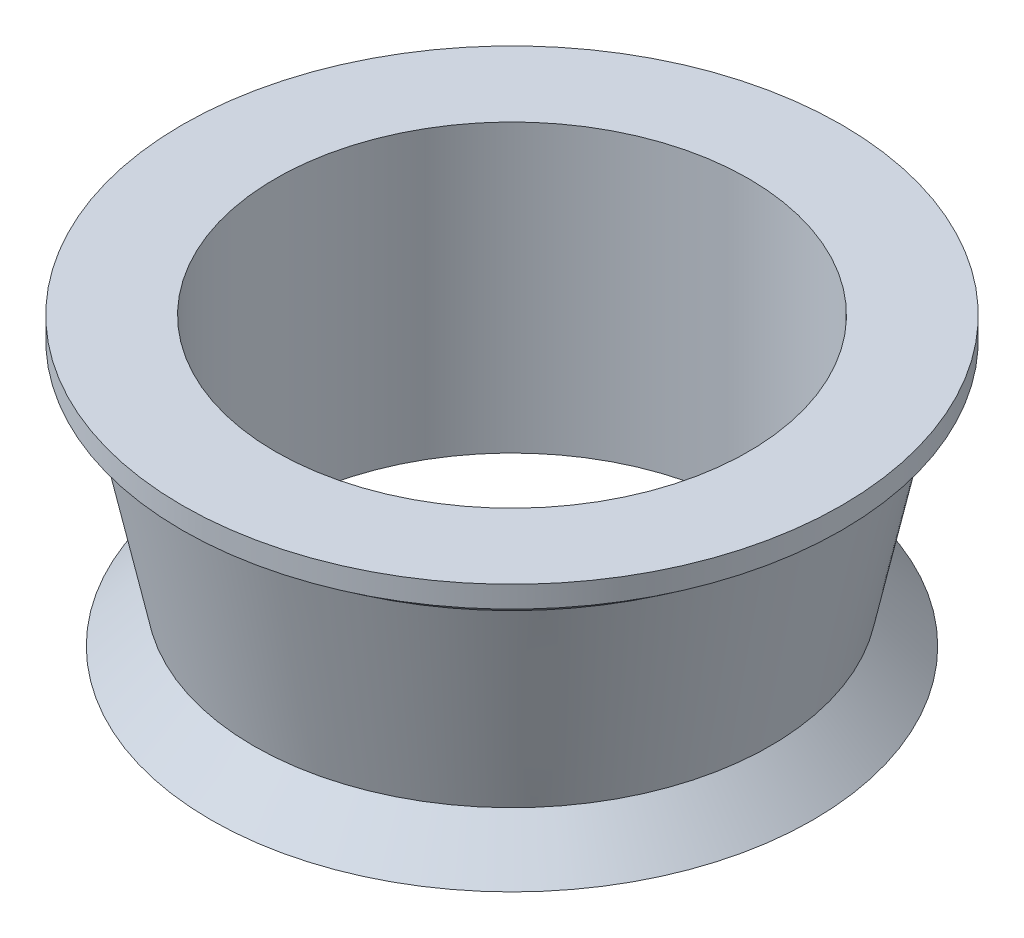
ISO-10303-21;
HEADER;
FILE_DESCRIPTION(('STEP AP214'),'2;1');
FILE_NAME('part.step','',(''),(''),'','','');
FILE_SCHEMA(('AUTOMOTIVE_DESIGN { 1 0 10303 214 1 1 1 1 }'));
ENDSEC;
DATA;
#1=APPLICATION_CONTEXT('core data for automotive mechanical design processes');
#2=APPLICATION_PROTOCOL_DEFINITION('international standard','automotive_design',2000,#1);
#3=PRODUCT_CONTEXT('',#1,'mechanical');
#4=PRODUCT('Part','Part','',(#3));
#5=PRODUCT_RELATED_PRODUCT_CATEGORY('part','',(#4));
#6=PRODUCT_DEFINITION_FORMATION('','',#4);
#7=PRODUCT_DEFINITION_CONTEXT('part definition',#1,'design');
#8=PRODUCT_DEFINITION('design','',#6,#7);
#9=PRODUCT_DEFINITION_SHAPE('','',#8);
#10=(LENGTH_UNIT() NAMED_UNIT(*) SI_UNIT(.MILLI.,.METRE.));
#11=(NAMED_UNIT(*) PLANE_ANGLE_UNIT() SI_UNIT($,.RADIAN.));
#12=(NAMED_UNIT(*) SI_UNIT($,.STERADIAN.) SOLID_ANGLE_UNIT());
#13=UNCERTAINTY_MEASURE_WITH_UNIT(LENGTH_MEASURE(1.E-05),#10,'distance_accuracy_value','');
#14=(GEOMETRIC_REPRESENTATION_CONTEXT(3) GLOBAL_UNCERTAINTY_ASSIGNED_CONTEXT((#13)) GLOBAL_UNIT_ASSIGNED_CONTEXT((#10,
#11,#12)) REPRESENTATION_CONTEXT('',''));
#15=CARTESIAN_POINT('',(0.,0.,0.));
#16=DIRECTION('',(0.,0.,1.));
#17=DIRECTION('',(1.,0.,0.));
#18=AXIS2_PLACEMENT_3D('',#15,#16,#17);
#19=CARTESIAN_POINT('',(0.,7.,0.));
#20=DIRECTION('',(0.,-1.,0.));
#21=DIRECTION('',(0.,0.,-1.));
#22=AXIS2_PLACEMENT_3D('',#19,#20,#21);
#23=CYLINDRICAL_SURFACE('',#22,8.25);
#24=CARTESIAN_POINT('',(0.,-1.5,0.));
#25=DIRECTION('',(0.,-1.,0.));
#26=DIRECTION('',(0.,0.,-1.));
#27=AXIS2_PLACEMENT_3D('',#24,#25,#26);
#28=CIRCLE('',#27,8.25);
#29=CARTESIAN_POINT('',(0.,-1.5,-8.25));
#30=VERTEX_POINT('',#29);
#31=EDGE_CURVE('E54',#30,#30,#28,.T.);
#32=ORIENTED_EDGE('',*,*,#31,.T.);
#33=EDGE_LOOP('',(#32));
#34=FACE_BOUND('',#33,.T.);
#35=CARTESIAN_POINT('',(0.,8.5,0.));
#36=DIRECTION('',(0.,1.,0.));
#37=DIRECTION('',(0.,0.,1.));
#38=AXIS2_PLACEMENT_3D('',#35,#36,#37);
#39=CIRCLE('',#38,8.25);
#40=CARTESIAN_POINT('',(0.,8.5,8.25));
#41=VERTEX_POINT('',#40);
#42=EDGE_CURVE('E60',#41,#41,#39,.T.);
#43=ORIENTED_EDGE('',*,*,#42,.T.);
#44=EDGE_LOOP('',(#43));
#45=FACE_BOUND('',#44,.T.);
#46=ADVANCED_FACE('F31',(#34,#45),#23,.F.);
#47=CARTESIAN_POINT('',(0.,7.00000000000007,0.));
#48=DIRECTION('',(0.,1.,0.));
#49=DIRECTION('',(0.,0.,1.));
#50=AXIS2_PLACEMENT_3D('',#47,#48,#49);
#51=CONICAL_SURFACE('',#50,10.5,0.209439510239317);
#52=CARTESIAN_POINT('',(0.,-0.00998227108943602,0.));
#53=DIRECTION('',(0.,1.,0.));
#54=DIRECTION('',(0.,0.,1.));
#55=AXIS2_PLACEMENT_3D('',#52,#53,#54);
#56=CIRCLE('',#55,9.00998227108942);
#57=CARTESIAN_POINT('',(0.,-0.00998227108943602,9.00998227108942));
#58=VERTEX_POINT('',#57);
#59=EDGE_CURVE('E42',#58,#58,#56,.T.);
#60=ORIENTED_EDGE('',*,*,#59,.T.);
#61=EDGE_LOOP('',(#60));
#62=FACE_BOUND('',#61,.T.);
#63=CARTESIAN_POINT('',(0.,7.,0.));
#64=DIRECTION('',(0.,1.,0.));
#65=DIRECTION('',(0.,0.,1.));
#66=AXIS2_PLACEMENT_3D('',#63,#64,#65);
#67=CIRCLE('',#66,10.5);
#68=CARTESIAN_POINT('',(0.,7.,10.5));
#69=VERTEX_POINT('',#68);
#70=EDGE_CURVE('E51',#69,#69,#67,.T.);
#71=ORIENTED_EDGE('',*,*,#70,.F.);
#72=EDGE_LOOP('',(#71));
#73=FACE_BOUND('',#72,.T.);
#74=ADVANCED_FACE('F77',(#62,#73),#51,.T.);
#75=CARTESIAN_POINT('',(0.,-1.5,0.));
#76=DIRECTION('',(0.,-1.,0.));
#77=DIRECTION('',(0.,0.,-1.));
#78=AXIS2_PLACEMENT_3D('',#75,#76,#77);
#79=PLANE('',#78);
#80=CARTESIAN_POINT('',(0.,-1.5,0.));
#81=DIRECTION('',(0.,-1.,0.));
#82=DIRECTION('',(0.,0.,-1.));
#83=AXIS2_PLACEMENT_3D('',#80,#81,#82);
#84=CIRCLE('',#83,10.5);
#85=CARTESIAN_POINT('',(0.,-1.5,-10.5));
#86=VERTEX_POINT('',#85);
#87=EDGE_CURVE('E46',#86,#86,#84,.T.);
#88=ORIENTED_EDGE('',*,*,#87,.T.);
#89=EDGE_LOOP('',(#88));
#90=FACE_BOUND('',#89,.T.);
#91=ORIENTED_EDGE('',*,*,#31,.F.);
#92=EDGE_LOOP('',(#91));
#93=FACE_BOUND('',#92,.T.);
#94=ADVANCED_FACE('F68',(#90,#93),#79,.T.);
#95=CARTESIAN_POINT('',(0.,8.5,0.));
#96=DIRECTION('',(0.,1.,0.));
#97=DIRECTION('',(0.,0.,1.));
#98=AXIS2_PLACEMENT_3D('',#95,#96,#97);
#99=PLANE('',#98);
#100=CARTESIAN_POINT('',(0.,8.5,0.));
#101=DIRECTION('',(0.,1.,0.));
#102=DIRECTION('',(0.,0.,1.));
#103=AXIS2_PLACEMENT_3D('',#100,#101,#102);
#104=CIRCLE('',#103,11.5);
#105=CARTESIAN_POINT('',(0.,8.5,11.5));
#106=VERTEX_POINT('',#105);
#107=EDGE_CURVE('E57',#106,#106,#104,.T.);
#108=ORIENTED_EDGE('',*,*,#107,.T.);
#109=EDGE_LOOP('',(#108));
#110=FACE_BOUND('',#109,.T.);
#111=ORIENTED_EDGE('',*,*,#42,.F.);
#112=EDGE_LOOP('',(#111));
#113=FACE_BOUND('',#112,.T.);
#114=ADVANCED_FACE('F65',(#110,#113),#99,.T.);
#115=CARTESIAN_POINT('',(0.,7.,0.));
#116=DIRECTION('',(0.,1.,0.));
#117=DIRECTION('',(0.,0.,1.));
#118=AXIS2_PLACEMENT_3D('',#115,#116,#117);
#119=PLANE('',#118);
#120=CARTESIAN_POINT('',(0.,7.,0.));
#121=DIRECTION('',(0.,1.,0.));
#122=DIRECTION('',(0.,0.,1.));
#123=AXIS2_PLACEMENT_3D('',#120,#121,#122);
#124=CIRCLE('',#123,10.5047163837847);
#125=CARTESIAN_POINT('',(0.,7.,10.5047163837847));
#126=VERTEX_POINT('',#125);
#127=EDGE_CURVE('E10',#126,#126,#124,.F.);
#128=ORIENTED_EDGE('',*,*,#127,.T.);
#129=EDGE_LOOP('',(#128));
#130=FACE_BOUND('',#129,.T.);
#131=ORIENTED_EDGE('',*,*,#70,.T.);
#132=EDGE_LOOP('',(#131));
#133=FACE_BOUND('',#132,.T.);
#134=ADVANCED_FACE('F67',(#130,#133),#119,.F.);
#135=CARTESIAN_POINT('',(0.,8.5,0.));
#136=DIRECTION('',(0.,-1.,0.));
#137=DIRECTION('',(0.,0.,-1.));
#138=AXIS2_PLACEMENT_3D('',#135,#136,#137);
#139=CYLINDRICAL_SURFACE('',#138,11.5);
#140=CARTESIAN_POINT('',(0.,7.75000000000001,0.));
#141=DIRECTION('',(0.,1.,0.));
#142=DIRECTION('',(0.,0.,1.));
#143=AXIS2_PLACEMENT_3D('',#140,#141,#142);
#144=CIRCLE('',#143,11.5);
#145=CARTESIAN_POINT('',(0.,7.75000000000001,11.5));
#146=VERTEX_POINT('',#145);
#147=EDGE_CURVE('E38',#146,#146,#144,.T.);
#148=ORIENTED_EDGE('',*,*,#147,.T.);
#149=EDGE_LOOP('',(#148));
#150=FACE_BOUND('',#149,.T.);
#151=ORIENTED_EDGE('',*,*,#107,.F.);
#152=EDGE_LOOP('',(#151));
#153=FACE_BOUND('',#152,.T.);
#154=ADVANCED_FACE('F75',(#150,#153),#139,.T.);
#155=CARTESIAN_POINT('',(0.,-2.00000000000004,0.));
#156=DIRECTION('',(0.,-1.,0.));
#157=DIRECTION('',(0.,0.,-1.));
#158=AXIS2_PLACEMENT_3D('',#155,#156,#157);
#159=CONICAL_SURFACE('',#158,11.,0.785398163397443);
#160=ORIENTED_EDGE('',*,*,#59,.F.);
#161=EDGE_LOOP('',(#160));
#162=FACE_BOUND('',#161,.T.);
#163=ORIENTED_EDGE('',*,*,#87,.F.);
#164=EDGE_LOOP('',(#163));
#165=FACE_BOUND('',#164,.T.);
#166=ADVANCED_FACE('F89',(#162,#165),#159,.T.);
#167=CARTESIAN_POINT('',(0.,7.75000000000001,0.));
#168=DIRECTION('',(0.,1.,0.));
#169=DIRECTION('',(0.,0.,1.));
#170=AXIS2_PLACEMENT_3D('',#167,#168,#169);
#171=CONICAL_SURFACE('',#170,11.5,0.92502450355699);
#172=ORIENTED_EDGE('',*,*,#127,.F.);
#173=EDGE_LOOP('',(#172));
#174=FACE_BOUND('',#173,.T.);
#175=ORIENTED_EDGE('',*,*,#147,.F.);
#176=EDGE_LOOP('',(#175));
#177=FACE_BOUND('',#176,.T.);
#178=ADVANCED_FACE('F33',(#174,#177),#171,.T.);
#179=CLOSED_SHELL('',(#46,#74,#94,#114,#134,#154,#166,#178));
#180=MANIFOLD_SOLID_BREP('B2',#179);
#181=ADVANCED_BREP_SHAPE_REPRESENTATION('',(#18,#180),#14);
#182=SHAPE_DEFINITION_REPRESENTATION(#9,#181);
ENDSEC;
END-ISO-10303-21;
